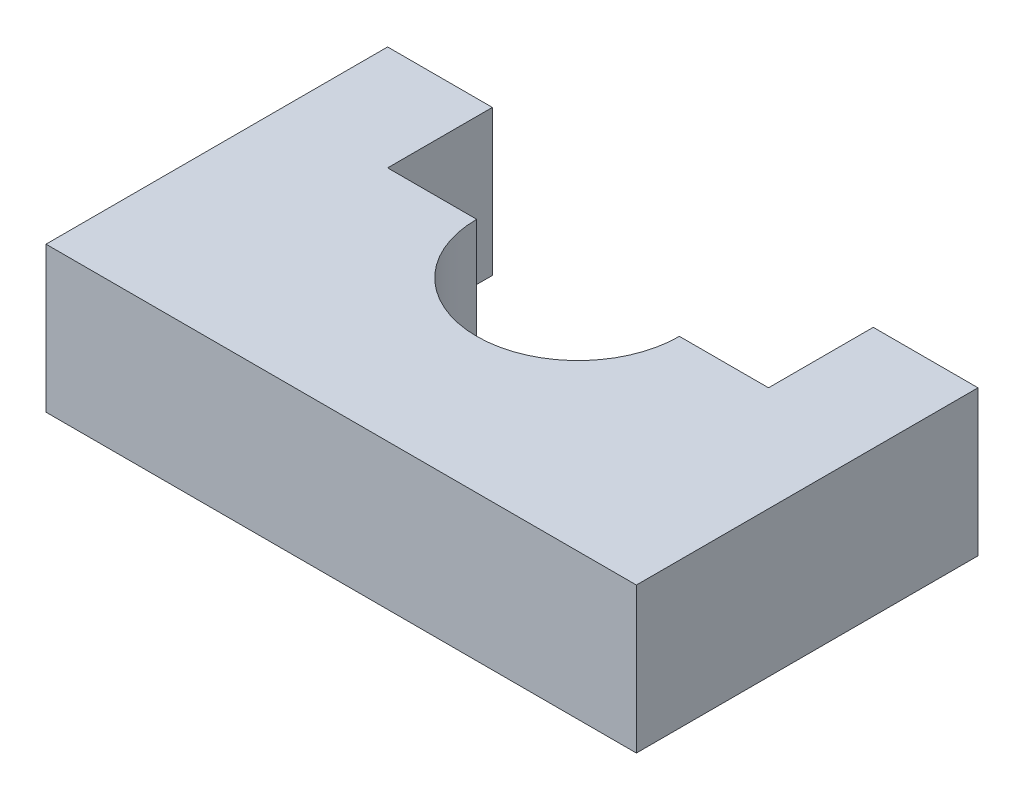
ISO-10303-21;
HEADER;
FILE_DESCRIPTION(('STEP AP214'),'2;1');
FILE_NAME('part.step','',(''),(''),'','','');
FILE_SCHEMA(('AUTOMOTIVE_DESIGN { 1 0 10303 214 1 1 1 1 }'));
ENDSEC;
DATA;
#1=APPLICATION_CONTEXT('core data for automotive mechanical design processes');
#2=APPLICATION_PROTOCOL_DEFINITION('international standard','automotive_design',2000,#1);
#3=PRODUCT_CONTEXT('',#1,'mechanical');
#4=PRODUCT('Part','Part','',(#3));
#5=PRODUCT_RELATED_PRODUCT_CATEGORY('part','',(#4));
#6=PRODUCT_DEFINITION_FORMATION('','',#4);
#7=PRODUCT_DEFINITION_CONTEXT('part definition',#1,'design');
#8=PRODUCT_DEFINITION('design','',#6,#7);
#9=PRODUCT_DEFINITION_SHAPE('','',#8);
#10=(LENGTH_UNIT() NAMED_UNIT(*) SI_UNIT(.MILLI.,.METRE.));
#11=(NAMED_UNIT(*) PLANE_ANGLE_UNIT() SI_UNIT($,.RADIAN.));
#12=(NAMED_UNIT(*) SI_UNIT($,.STERADIAN.) SOLID_ANGLE_UNIT());
#13=UNCERTAINTY_MEASURE_WITH_UNIT(LENGTH_MEASURE(1.E-05),#10,'distance_accuracy_value','');
#14=(GEOMETRIC_REPRESENTATION_CONTEXT(3) GLOBAL_UNCERTAINTY_ASSIGNED_CONTEXT((#13)) GLOBAL_UNIT_ASSIGNED_CONTEXT((#10,
#11,#12)) REPRESENTATION_CONTEXT('',''));
#15=CARTESIAN_POINT('',(0.,0.,0.));
#16=DIRECTION('',(0.,0.,1.));
#17=DIRECTION('',(1.,0.,0.));
#18=AXIS2_PLACEMENT_3D('',#15,#16,#17);
#19=CARTESIAN_POINT('',(30.422457210489,15.,0.));
#20=DIRECTION('',(-1.,0.,0.));
#21=DIRECTION('',(0.,0.,1.));
#22=AXIS2_PLACEMENT_3D('',#19,#20,#21);
#23=PLANE('',#22);
#24=DIRECTION('',(0.,0.,-1.));
#25=VECTOR('',#24,1.);
#26=CARTESIAN_POINT('',(30.422457210489,0.,0.));
#27=LINE('',#26,#25);
#28=CARTESIAN_POINT('',(30.422457210489,0.,0.));
#29=VERTEX_POINT('',#28);
#30=CARTESIAN_POINT('',(30.422457210489,0.,-35.2066339492352));
#31=VERTEX_POINT('',#30);
#32=EDGE_CURVE('E145',#29,#31,#27,.T.);
#33=ORIENTED_EDGE('',*,*,#32,.T.);
#34=DIRECTION('',(0.,-1.,0.));
#35=VECTOR('',#34,1.);
#36=CARTESIAN_POINT('',(30.422457210489,15.,-35.2066339492352));
#37=LINE('',#36,#35);
#38=CARTESIAN_POINT('',(30.422457210489,15.,-35.2066339492352));
#39=VERTEX_POINT('',#38);
#40=EDGE_CURVE('E11',#39,#31,#37,.T.);
#41=ORIENTED_EDGE('',*,*,#40,.F.);
#42=DIRECTION('',(0.,0.,-1.));
#43=VECTOR('',#42,1.);
#44=CARTESIAN_POINT('',(30.422457210489,15.,0.));
#45=LINE('',#44,#43);
#46=CARTESIAN_POINT('',(30.422457210489,15.,0.));
#47=VERTEX_POINT('',#46);
#48=EDGE_CURVE('E163',#47,#39,#45,.T.);
#49=ORIENTED_EDGE('',*,*,#48,.F.);
#50=DIRECTION('',(0.,-1.,0.));
#51=VECTOR('',#50,1.);
#52=CARTESIAN_POINT('',(30.422457210489,15.,0.));
#53=LINE('',#52,#51);
#54=EDGE_CURVE('E141',#47,#29,#53,.T.);
#55=ORIENTED_EDGE('',*,*,#54,.T.);
#56=EDGE_LOOP('',(#33,#41,#49,#55));
#57=FACE_BOUND('',#56,.T.);
#58=ADVANCED_FACE('F37',(#57),#23,.F.);
#59=CARTESIAN_POINT('',(30.422457210489,15.,-35.2066339492352));
#60=DIRECTION('',(0.,0.,1.));
#61=DIRECTION('',(1.,0.,0.));
#62=AXIS2_PLACEMENT_3D('',#59,#60,#61);
#63=PLANE('',#62);
#64=DIRECTION('',(-1.,0.,0.));
#65=VECTOR('',#64,1.);
#66=CARTESIAN_POINT('',(30.422457210489,0.,-35.2066339492352));
#67=LINE('',#66,#65);
#68=CARTESIAN_POINT('',(19.6273917487025,0.,-35.2066339492352));
#69=VERTEX_POINT('',#68);
#70=EDGE_CURVE('E148',#31,#69,#67,.T.);
#71=ORIENTED_EDGE('',*,*,#70,.T.);
#72=DIRECTION('',(0.,-1.,0.));
#73=VECTOR('',#72,1.);
#74=CARTESIAN_POINT('',(19.6273917487025,15.,-35.2066339492352));
#75=LINE('',#74,#73);
#76=CARTESIAN_POINT('',(19.6273917487025,15.,-35.2066339492352));
#77=VERTEX_POINT('',#76);
#78=EDGE_CURVE('E45',#77,#69,#75,.T.);
#79=ORIENTED_EDGE('',*,*,#78,.F.);
#80=DIRECTION('',(-1.,0.,0.));
#81=VECTOR('',#80,1.);
#82=CARTESIAN_POINT('',(30.422457210489,15.,-35.2066339492352));
#83=LINE('',#82,#81);
#84=EDGE_CURVE('E102',#39,#77,#83,.T.);
#85=ORIENTED_EDGE('',*,*,#84,.F.);
#86=ORIENTED_EDGE('',*,*,#40,.T.);
#87=EDGE_LOOP('',(#71,#79,#85,#86));
#88=FACE_BOUND('',#87,.T.);
#89=ADVANCED_FACE('F212',(#88),#63,.F.);
#90=CARTESIAN_POINT('',(19.6273917487025,15.,-24.4115684874488));
#91=DIRECTION('',(1.,0.,0.));
#92=DIRECTION('',(0.,0.,-1.));
#93=AXIS2_PLACEMENT_3D('',#90,#91,#92);
#94=PLANE('',#93);
#95=DIRECTION('',(0.,0.,1.));
#96=VECTOR('',#95,1.);
#97=CARTESIAN_POINT('',(19.6273917487025,0.,-24.4115684874488));
#98=LINE('',#97,#96);
#99=CARTESIAN_POINT('',(19.6273917487025,0.,-24.4115684874488));
#100=VERTEX_POINT('',#99);
#101=EDGE_CURVE('E150',#69,#100,#98,.T.);
#102=ORIENTED_EDGE('',*,*,#101,.T.);
#103=DIRECTION('',(0.,-1.,0.));
#104=VECTOR('',#103,1.);
#105=CARTESIAN_POINT('',(19.6273917487025,15.,-24.4115684874488));
#106=LINE('',#105,#104);
#107=CARTESIAN_POINT('',(19.6273917487025,15.,-24.4115684874488));
#108=VERTEX_POINT('',#107);
#109=EDGE_CURVE('E176',#108,#100,#106,.T.);
#110=ORIENTED_EDGE('',*,*,#109,.F.);
#111=DIRECTION('',(0.,0.,1.));
#112=VECTOR('',#111,1.);
#113=CARTESIAN_POINT('',(19.6273917487025,15.,-24.4115684874488));
#114=LINE('',#113,#112);
#115=EDGE_CURVE('E184',#77,#108,#114,.T.);
#116=ORIENTED_EDGE('',*,*,#115,.F.);
#117=ORIENTED_EDGE('',*,*,#78,.T.);
#118=EDGE_LOOP('',(#102,#110,#116,#117));
#119=FACE_BOUND('',#118,.T.);
#120=ADVANCED_FACE('F182',(#119),#94,.F.);
#121=CARTESIAN_POINT('',(10.4465167709431,15.,-24.4115684874488));
#122=DIRECTION('',(0.,0.,1.));
#123=DIRECTION('',(1.,0.,0.));
#124=AXIS2_PLACEMENT_3D('',#121,#122,#123);
#125=PLANE('',#124);
#126=DIRECTION('',(-1.,0.,0.));
#127=VECTOR('',#126,1.);
#128=CARTESIAN_POINT('',(10.4465167709431,0.,-24.4115684874488));
#129=LINE('',#128,#127);
#130=CARTESIAN_POINT('',(10.4465167709431,0.,-24.4115684874488));
#131=VERTEX_POINT('',#130);
#132=EDGE_CURVE('E152',#100,#131,#129,.T.);
#133=ORIENTED_EDGE('',*,*,#132,.T.);
#134=DIRECTION('',(0.,-1.,0.));
#135=VECTOR('',#134,1.);
#136=CARTESIAN_POINT('',(10.4465167709431,15.,-24.4115684874488));
#137=LINE('',#136,#135);
#138=CARTESIAN_POINT('',(10.4465167709431,15.,-24.4115684874488));
#139=VERTEX_POINT('',#138);
#140=EDGE_CURVE('E173',#139,#131,#137,.T.);
#141=ORIENTED_EDGE('',*,*,#140,.F.);
#142=DIRECTION('',(-1.,0.,0.));
#143=VECTOR('',#142,1.);
#144=CARTESIAN_POINT('',(10.4465167709431,15.,-24.4115684874488));
#145=LINE('',#144,#143);
#146=EDGE_CURVE('E202',#108,#139,#145,.T.);
#147=ORIENTED_EDGE('',*,*,#146,.F.);
#148=ORIENTED_EDGE('',*,*,#109,.T.);
#149=EDGE_LOOP('',(#133,#141,#147,#148));
#150=FACE_BOUND('',#149,.T.);
#151=ADVANCED_FACE('F193',(#150),#125,.F.);
#152=CARTESIAN_POINT('',(0.,15.,-24.4115684874488));
#153=DIRECTION('',(0.,-1.,0.));
#154=DIRECTION('',(0.,0.,-1.));
#155=AXIS2_PLACEMENT_3D('',#152,#153,#154);
#156=CYLINDRICAL_SURFACE('',#155,10.4465167709431);
#157=CARTESIAN_POINT('',(0.,0.,-24.4115684874488));
#158=DIRECTION('',(0.,-1.,0.));
#159=DIRECTION('',(0.,0.,1.));
#160=AXIS2_PLACEMENT_3D('',#157,#158,#159);
#161=CIRCLE('',#160,10.4465167709431);
#162=CARTESIAN_POINT('',(-10.4465167709431,0.,-24.4115684874488));
#163=VERTEX_POINT('',#162);
#164=EDGE_CURVE('E154',#131,#163,#161,.T.);
#165=ORIENTED_EDGE('',*,*,#164,.T.);
#166=DIRECTION('',(0.,-1.,0.));
#167=VECTOR('',#166,1.);
#168=CARTESIAN_POINT('',(-10.4465167709431,15.,-24.4115684874488));
#169=LINE('',#168,#167);
#170=CARTESIAN_POINT('',(-10.4465167709431,15.,-24.4115684874488));
#171=VERTEX_POINT('',#170);
#172=EDGE_CURVE('E170',#171,#163,#169,.T.);
#173=ORIENTED_EDGE('',*,*,#172,.F.);
#174=CARTESIAN_POINT('',(0.,15.,-24.4115684874488));
#175=DIRECTION('',(0.,-1.,0.));
#176=DIRECTION('',(0.,0.,1.));
#177=AXIS2_PLACEMENT_3D('',#174,#175,#176);
#178=CIRCLE('',#177,10.4465167709431);
#179=EDGE_CURVE('E199',#139,#171,#178,.T.);
#180=ORIENTED_EDGE('',*,*,#179,.F.);
#181=ORIENTED_EDGE('',*,*,#140,.T.);
#182=EDGE_LOOP('',(#165,#173,#180,#181));
#183=FACE_BOUND('',#182,.T.);
#184=ADVANCED_FACE('F197',(#183),#156,.F.);
#185=CARTESIAN_POINT('',(-19.6273917487025,15.,-24.4115684874488));
#186=DIRECTION('',(0.,0.,1.));
#187=DIRECTION('',(1.,0.,0.));
#188=AXIS2_PLACEMENT_3D('',#185,#186,#187);
#189=PLANE('',#188);
#190=DIRECTION('',(-1.,0.,0.));
#191=VECTOR('',#190,1.);
#192=CARTESIAN_POINT('',(-19.6273917487025,0.,-24.4115684874488));
#193=LINE('',#192,#191);
#194=CARTESIAN_POINT('',(-19.6273917487025,0.,-24.4115684874488));
#195=VERTEX_POINT('',#194);
#196=EDGE_CURVE('E156',#163,#195,#193,.T.);
#197=ORIENTED_EDGE('',*,*,#196,.T.);
#198=DIRECTION('',(0.,-1.,0.));
#199=VECTOR('',#198,1.);
#200=CARTESIAN_POINT('',(-19.6273917487025,15.,-24.4115684874488));
#201=LINE('',#200,#199);
#202=CARTESIAN_POINT('',(-19.6273917487025,15.,-24.4115684874488));
#203=VERTEX_POINT('',#202);
#204=EDGE_CURVE('E167',#203,#195,#201,.T.);
#205=ORIENTED_EDGE('',*,*,#204,.F.);
#206=DIRECTION('',(-1.,0.,0.));
#207=VECTOR('',#206,1.);
#208=CARTESIAN_POINT('',(-19.6273917487025,15.,-24.4115684874488));
#209=LINE('',#208,#207);
#210=EDGE_CURVE('E201',#171,#203,#209,.T.);
#211=ORIENTED_EDGE('',*,*,#210,.F.);
#212=ORIENTED_EDGE('',*,*,#172,.T.);
#213=EDGE_LOOP('',(#197,#205,#211,#212));
#214=FACE_BOUND('',#213,.T.);
#215=ADVANCED_FACE('F224',(#214),#189,.F.);
#216=CARTESIAN_POINT('',(-19.6273917487025,15.,-35.2066339492352));
#217=DIRECTION('',(-1.,0.,0.));
#218=DIRECTION('',(0.,0.,1.));
#219=AXIS2_PLACEMENT_3D('',#216,#217,#218);
#220=PLANE('',#219);
#221=DIRECTION('',(0.,0.,-1.));
#222=VECTOR('',#221,1.);
#223=CARTESIAN_POINT('',(-19.6273917487025,0.,-35.2066339492352));
#224=LINE('',#223,#222);
#225=CARTESIAN_POINT('',(-19.6273917487025,0.,-35.2066339492352));
#226=VERTEX_POINT('',#225);
#227=EDGE_CURVE('E158',#195,#226,#224,.T.);
#228=ORIENTED_EDGE('',*,*,#227,.T.);
#229=DIRECTION('',(0.,-1.,0.));
#230=VECTOR('',#229,1.);
#231=CARTESIAN_POINT('',(-19.6273917487025,15.,-35.2066339492352));
#232=LINE('',#231,#230);
#233=CARTESIAN_POINT('',(-19.6273917487025,15.,-35.2066339492352));
#234=VERTEX_POINT('',#233);
#235=EDGE_CURVE('E136',#234,#226,#232,.T.);
#236=ORIENTED_EDGE('',*,*,#235,.F.);
#237=DIRECTION('',(0.,0.,-1.));
#238=VECTOR('',#237,1.);
#239=CARTESIAN_POINT('',(-19.6273917487025,15.,-35.2066339492352));
#240=LINE('',#239,#238);
#241=EDGE_CURVE('E127',#203,#234,#240,.T.);
#242=ORIENTED_EDGE('',*,*,#241,.F.);
#243=ORIENTED_EDGE('',*,*,#204,.T.);
#244=EDGE_LOOP('',(#228,#236,#242,#243));
#245=FACE_BOUND('',#244,.T.);
#246=ADVANCED_FACE('F227',(#245),#220,.F.);
#247=CARTESIAN_POINT('',(-30.422457210489,15.,-35.2066339492352));
#248=DIRECTION('',(0.,0.,1.));
#249=DIRECTION('',(1.,0.,0.));
#250=AXIS2_PLACEMENT_3D('',#247,#248,#249);
#251=PLANE('',#250);
#252=DIRECTION('',(-1.,0.,0.));
#253=VECTOR('',#252,1.);
#254=CARTESIAN_POINT('',(-30.422457210489,0.,-35.2066339492352));
#255=LINE('',#254,#253);
#256=CARTESIAN_POINT('',(-30.422457210489,0.,-35.2066339492352));
#257=VERTEX_POINT('',#256);
#258=EDGE_CURVE('E135',#226,#257,#255,.T.);
#259=ORIENTED_EDGE('',*,*,#258,.T.);
#260=DIRECTION('',(0.,-1.,0.));
#261=VECTOR('',#260,1.);
#262=CARTESIAN_POINT('',(-30.422457210489,15.,-35.2066339492352));
#263=LINE('',#262,#261);
#264=CARTESIAN_POINT('',(-30.422457210489,15.,-35.2066339492352));
#265=VERTEX_POINT('',#264);
#266=EDGE_CURVE('E132',#265,#257,#263,.T.);
#267=ORIENTED_EDGE('',*,*,#266,.F.);
#268=DIRECTION('',(-1.,0.,0.));
#269=VECTOR('',#268,1.);
#270=CARTESIAN_POINT('',(-30.422457210489,15.,-35.2066339492352));
#271=LINE('',#270,#269);
#272=EDGE_CURVE('E121',#234,#265,#271,.T.);
#273=ORIENTED_EDGE('',*,*,#272,.F.);
#274=ORIENTED_EDGE('',*,*,#235,.T.);
#275=EDGE_LOOP('',(#259,#267,#273,#274));
#276=FACE_BOUND('',#275,.T.);
#277=ADVANCED_FACE('F133',(#276),#251,.F.);
#278=CARTESIAN_POINT('',(-30.422457210489,15.,0.));
#279=DIRECTION('',(1.,0.,0.));
#280=DIRECTION('',(0.,0.,-1.));
#281=AXIS2_PLACEMENT_3D('',#278,#279,#280);
#282=PLANE('',#281);
#283=DIRECTION('',(0.,0.,1.));
#284=VECTOR('',#283,1.);
#285=CARTESIAN_POINT('',(-30.422457210489,0.,0.));
#286=LINE('',#285,#284);
#287=CARTESIAN_POINT('',(-30.422457210489,0.,0.));
#288=VERTEX_POINT('',#287);
#289=EDGE_CURVE('E88',#257,#288,#286,.T.);
#290=ORIENTED_EDGE('',*,*,#289,.T.);
#291=DIRECTION('',(0.,-1.,0.));
#292=VECTOR('',#291,1.);
#293=CARTESIAN_POINT('',(-30.422457210489,15.,0.));
#294=LINE('',#293,#292);
#295=CARTESIAN_POINT('',(-30.422457210489,15.,0.));
#296=VERTEX_POINT('',#295);
#297=EDGE_CURVE('E137',#296,#288,#294,.T.);
#298=ORIENTED_EDGE('',*,*,#297,.F.);
#299=DIRECTION('',(0.,0.,1.));
#300=VECTOR('',#299,1.);
#301=CARTESIAN_POINT('',(-30.422457210489,15.,0.));
#302=LINE('',#301,#300);
#303=EDGE_CURVE('E125',#265,#296,#302,.T.);
#304=ORIENTED_EDGE('',*,*,#303,.F.);
#305=ORIENTED_EDGE('',*,*,#266,.T.);
#306=EDGE_LOOP('',(#290,#298,#304,#305));
#307=FACE_BOUND('',#306,.T.);
#308=ADVANCED_FACE('F139',(#307),#282,.F.);
#309=CARTESIAN_POINT('',(-30.422457210489,15.,0.));
#310=DIRECTION('',(0.,0.,-1.));
#311=DIRECTION('',(-1.,0.,0.));
#312=AXIS2_PLACEMENT_3D('',#309,#310,#311);
#313=PLANE('',#312);
#314=DIRECTION('',(1.,0.,0.));
#315=VECTOR('',#314,1.);
#316=CARTESIAN_POINT('',(-30.422457210489,0.,0.));
#317=LINE('',#316,#315);
#318=EDGE_CURVE('E94',#288,#29,#317,.T.);
#319=ORIENTED_EDGE('',*,*,#318,.T.);
#320=ORIENTED_EDGE('',*,*,#54,.F.);
#321=DIRECTION('',(1.,0.,0.));
#322=VECTOR('',#321,1.);
#323=CARTESIAN_POINT('',(-30.422457210489,15.,0.));
#324=LINE('',#323,#322);
#325=EDGE_CURVE('E53',#296,#47,#324,.T.);
#326=ORIENTED_EDGE('',*,*,#325,.F.);
#327=ORIENTED_EDGE('',*,*,#297,.T.);
#328=EDGE_LOOP('',(#319,#320,#326,#327));
#329=FACE_BOUND('',#328,.T.);
#330=ADVANCED_FACE('F236',(#329),#313,.F.);
#331=CARTESIAN_POINT('',(0.,15.,-24.4115684874488));
#332=DIRECTION('',(0.,1.,0.));
#333=DIRECTION('',(0.,0.,1.));
#334=AXIS2_PLACEMENT_3D('',#331,#332,#333);
#335=PLANE('',#334);
#336=ORIENTED_EDGE('',*,*,#48,.T.);
#337=ORIENTED_EDGE('',*,*,#84,.T.);
#338=ORIENTED_EDGE('',*,*,#115,.T.);
#339=ORIENTED_EDGE('',*,*,#146,.T.);
#340=ORIENTED_EDGE('',*,*,#179,.T.);
#341=ORIENTED_EDGE('',*,*,#210,.T.);
#342=ORIENTED_EDGE('',*,*,#241,.T.);
#343=ORIENTED_EDGE('',*,*,#272,.T.);
#344=ORIENTED_EDGE('',*,*,#303,.T.);
#345=ORIENTED_EDGE('',*,*,#325,.T.);
#346=EDGE_LOOP('',(#336,#337,#338,#339,#340,#341,#342,#343,#344,#345));
#347=FACE_BOUND('',#346,.T.);
#348=ADVANCED_FACE('F123',(#347),#335,.T.);
#349=CARTESIAN_POINT('',(0.,0.,-24.4115684874488));
#350=DIRECTION('',(0.,1.,0.));
#351=DIRECTION('',(0.,0.,1.));
#352=AXIS2_PLACEMENT_3D('',#349,#350,#351);
#353=PLANE('',#352);
#354=ORIENTED_EDGE('',*,*,#32,.F.);
#355=ORIENTED_EDGE('',*,*,#318,.F.);
#356=ORIENTED_EDGE('',*,*,#289,.F.);
#357=ORIENTED_EDGE('',*,*,#258,.F.);
#358=ORIENTED_EDGE('',*,*,#227,.F.);
#359=ORIENTED_EDGE('',*,*,#196,.F.);
#360=ORIENTED_EDGE('',*,*,#164,.F.);
#361=ORIENTED_EDGE('',*,*,#132,.F.);
#362=ORIENTED_EDGE('',*,*,#101,.F.);
#363=ORIENTED_EDGE('',*,*,#70,.F.);
#364=EDGE_LOOP('',(#354,#355,#356,#357,#358,#359,#360,#361,#362,#363));
#365=FACE_BOUND('',#364,.T.);
#366=ADVANCED_FACE('F188',(#365),#353,.F.);
#367=CLOSED_SHELL('',(#58,#89,#120,#151,#184,#215,#246,#277,#308,#330,#348,#366));
#368=MANIFOLD_SOLID_BREP('B2',#367);
#369=ADVANCED_BREP_SHAPE_REPRESENTATION('',(#18,#368),#14);
#370=SHAPE_DEFINITION_REPRESENTATION(#9,#369);
ENDSEC;
END-ISO-10303-21;
